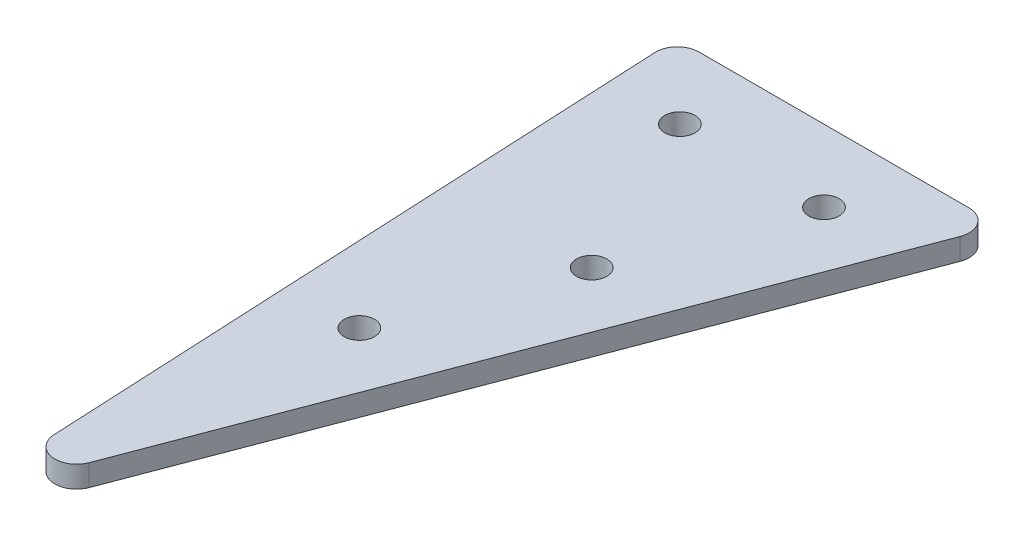
ISO-10303-21;
HEADER;
FILE_DESCRIPTION(('STEP AP214'),'2;1');
FILE_NAME('part.step','',(''),(''),'','','');
FILE_SCHEMA(('AUTOMOTIVE_DESIGN { 1 0 10303 214 1 1 1 1 }'));
ENDSEC;
DATA;
#1=APPLICATION_CONTEXT('core data for automotive mechanical design processes');
#2=APPLICATION_PROTOCOL_DEFINITION('international standard','automotive_design',2000,#1);
#3=PRODUCT_CONTEXT('',#1,'mechanical');
#4=PRODUCT('Part','Part','',(#3));
#5=PRODUCT_RELATED_PRODUCT_CATEGORY('part','',(#4));
#6=PRODUCT_DEFINITION_FORMATION('','',#4);
#7=PRODUCT_DEFINITION_CONTEXT('part definition',#1,'design');
#8=PRODUCT_DEFINITION('design','',#6,#7);
#9=PRODUCT_DEFINITION_SHAPE('','',#8);
#10=(LENGTH_UNIT() NAMED_UNIT(*) SI_UNIT(.MILLI.,.METRE.));
#11=(NAMED_UNIT(*) PLANE_ANGLE_UNIT() SI_UNIT($,.RADIAN.));
#12=(NAMED_UNIT(*) SI_UNIT($,.STERADIAN.) SOLID_ANGLE_UNIT());
#13=UNCERTAINTY_MEASURE_WITH_UNIT(LENGTH_MEASURE(1.E-05),#10,'distance_accuracy_value','');
#14=(GEOMETRIC_REPRESENTATION_CONTEXT(3) GLOBAL_UNCERTAINTY_ASSIGNED_CONTEXT((#13)) GLOBAL_UNIT_ASSIGNED_CONTEXT((#10,
#11,#12)) REPRESENTATION_CONTEXT('',''));
#15=CARTESIAN_POINT('',(0.,0.,0.));
#16=DIRECTION('',(0.,0.,1.));
#17=DIRECTION('',(1.,0.,0.));
#18=AXIS2_PLACEMENT_3D('',#15,#16,#17);
#19=CARTESIAN_POINT('',(0.,3.,0.));
#20=DIRECTION('',(0.,1.,0.));
#21=DIRECTION('',(0.,0.,1.));
#22=AXIS2_PLACEMENT_3D('',#19,#20,#21);
#23=PLANE('',#22);
#24=CARTESIAN_POINT('',(-8.86951562651772,3.,23.3737393788619));
#25=DIRECTION('',(0.,1.,0.));
#26=DIRECTION('',(0.,0.,1.));
#27=AXIS2_PLACEMENT_3D('',#24,#25,#26);
#28=CIRCLE('',#27,2.1);
#29=CARTESIAN_POINT('',(-8.86951562651772,3.,25.4737393788619));
#30=VERTEX_POINT('',#29);
#31=EDGE_CURVE('E157',#30,#30,#28,.T.);
#32=ORIENTED_EDGE('',*,*,#31,.F.);
#33=EDGE_LOOP('',(#32));
#34=FACE_BOUND('',#33,.T.);
#35=CARTESIAN_POINT('',(0.,3.,0.));
#36=DIRECTION('',(0.,1.,0.));
#37=DIRECTION('',(0.,0.,1.));
#38=AXIS2_PLACEMENT_3D('',#35,#36,#37);
#39=CIRCLE('',#38,2.1);
#40=CARTESIAN_POINT('',(0.,3.,2.1));
#41=VERTEX_POINT('',#40);
#42=EDGE_CURVE('E120',#41,#41,#39,.T.);
#43=ORIENTED_EDGE('',*,*,#42,.F.);
#44=EDGE_LOOP('',(#43));
#45=FACE_BOUND('',#44,.T.);
#46=DIRECTION('',(-1.,0.,0.));
#47=VECTOR('',#46,1.);
#48=CARTESIAN_POINT('',(-30.4953450750171,3.,-10.));
#49=LINE('',#48,#47);
#50=CARTESIAN_POINT('',(10.1432896783317,3.,-10.));
#51=VERTEX_POINT('',#50);
#52=CARTESIAN_POINT('',(-27.346741552512,3.,-10.));
#53=VERTEX_POINT('',#52);
#54=EDGE_CURVE('E128',#51,#53,#49,.T.);
#55=ORIENTED_EDGE('',*,*,#54,.T.);
#56=CARTESIAN_POINT('',(-27.346741552512,3.,-7.));
#57=DIRECTION('',(0.,1.,0.));
#58=DIRECTION('',(0.,0.,1.));
#59=AXIS2_PLACEMENT_3D('',#56,#57,#58);
#60=CIRCLE('',#59,3.);
#61=CARTESIAN_POINT('',(-30.3432388530827,3.,-6.85507268141526));
#62=VERTEX_POINT('',#61);
#63=EDGE_CURVE('E141',#53,#62,#60,.T.);
#64=ORIENTED_EDGE('',*,*,#63,.T.);
#65=DIRECTION('',(0.0483091061949142,0.,0.998832433523586));
#66=VECTOR('',#65,1.);
#67=CARTESIAN_POINT('',(-30.4953450750171,3.,-10.));
#68=LINE('',#67,#66);
#69=CARTESIAN_POINT('',(-26.1050494062996,3.,80.7731492480979));
#70=VERTEX_POINT('',#69);
#71=EDGE_CURVE('E112',#62,#70,#68,.T.);
#72=ORIENTED_EDGE('',*,*,#71,.T.);
#73=CARTESIAN_POINT('',(-23.1085521057289,3.,80.6282219295132));
#74=DIRECTION('',(0.,1.,0.));
#75=DIRECTION('',(0.,0.,1.));
#76=AXIS2_PLACEMENT_3D('',#73,#74,#75);
#77=CIRCLE('',#76,3.);
#78=CARTESIAN_POINT('',(-20.3037033802655,3.,81.6925638046953));
#79=VERTEX_POINT('',#78);
#80=EDGE_CURVE('E60',#70,#79,#77,.T.);
#81=ORIENTED_EDGE('',*,*,#80,.T.);
#82=DIRECTION('',(0.354780625060709,0.,-0.934949575154475));
#83=VECTOR('',#82,1.);
#84=CARTESIAN_POINT('',(14.4904138261881,3.,-10.));
#85=LINE('',#84,#83);
#86=CARTESIAN_POINT('',(12.9481384037951,3.,-5.93565812481787));
#87=VERTEX_POINT('',#86);
#88=EDGE_CURVE('E148',#79,#87,#85,.T.);
#89=ORIENTED_EDGE('',*,*,#88,.T.);
#90=CARTESIAN_POINT('',(10.1432896783317,3.,-7.));
#91=DIRECTION('',(0.,1.,0.));
#92=DIRECTION('',(0.,0.,1.));
#93=AXIS2_PLACEMENT_3D('',#90,#91,#92);
#94=CIRCLE('',#93,3.);
#95=EDGE_CURVE('E138',#87,#51,#94,.T.);
#96=ORIENTED_EDGE('',*,*,#95,.T.);
#97=EDGE_LOOP('',(#55,#64,#72,#81,#89,#96));
#98=FACE_BOUND('',#97,.T.);
#99=CARTESIAN_POINT('',(-20.,3.,0.));
#100=DIRECTION('',(0.,1.,0.));
#101=DIRECTION('',(0.,0.,1.));
#102=AXIS2_PLACEMENT_3D('',#99,#100,#101);
#103=CIRCLE('',#102,2.1);
#104=CARTESIAN_POINT('',(-20.,3.,2.1));
#105=VERTEX_POINT('',#104);
#106=EDGE_CURVE('E152',#105,#105,#103,.T.);
#107=ORIENTED_EDGE('',*,*,#106,.F.);
#108=EDGE_LOOP('',(#107));
#109=FACE_BOUND('',#108,.T.);
#110=CARTESIAN_POINT('',(-17.7390312530354,3.,46.7474787577237));
#111=DIRECTION('',(0.,1.,0.));
#112=DIRECTION('',(0.,0.,1.));
#113=AXIS2_PLACEMENT_3D('',#110,#111,#112);
#114=CIRCLE('',#113,2.1);
#115=CARTESIAN_POINT('',(-17.7390312530354,3.,48.8474787577237));
#116=VERTEX_POINT('',#115);
#117=EDGE_CURVE('E163',#116,#116,#114,.T.);
#118=ORIENTED_EDGE('',*,*,#117,.F.);
#119=EDGE_LOOP('',(#118));
#120=FACE_BOUND('',#119,.T.);
#121=ADVANCED_FACE('F39',(#34,#45,#98,#109,#120),#23,.T.);
#122=CARTESIAN_POINT('',(0.,0.,0.));
#123=DIRECTION('',(0.,1.,0.));
#124=DIRECTION('',(0.,0.,1.));
#125=AXIS2_PLACEMENT_3D('',#122,#123,#124);
#126=PLANE('',#125);
#127=DIRECTION('',(0.0483091061949142,0.,0.998832433523586));
#128=VECTOR('',#127,1.);
#129=CARTESIAN_POINT('',(-30.4953450750171,0.,-10.));
#130=LINE('',#129,#128);
#131=CARTESIAN_POINT('',(-30.3432388530827,0.,-6.85507268141526));
#132=VERTEX_POINT('',#131);
#133=CARTESIAN_POINT('',(-26.1050494062996,0.,80.7731492480979));
#134=VERTEX_POINT('',#133);
#135=EDGE_CURVE('E110',#132,#134,#130,.T.);
#136=ORIENTED_EDGE('',*,*,#135,.F.);
#137=CARTESIAN_POINT('',(-27.346741552512,0.,-7.));
#138=DIRECTION('',(0.,1.,0.));
#139=DIRECTION('',(0.,0.,1.));
#140=AXIS2_PLACEMENT_3D('',#137,#138,#139);
#141=CIRCLE('',#140,3.);
#142=CARTESIAN_POINT('',(-27.346741552512,0.,-10.));
#143=VERTEX_POINT('',#142);
#144=EDGE_CURVE('E93',#132,#143,#141,.F.);
#145=ORIENTED_EDGE('',*,*,#144,.T.);
#146=DIRECTION('',(-1.,0.,0.));
#147=VECTOR('',#146,1.);
#148=CARTESIAN_POINT('',(-30.4953450750171,0.,-10.));
#149=LINE('',#148,#147);
#150=CARTESIAN_POINT('',(10.1432896783317,0.,-10.));
#151=VERTEX_POINT('',#150);
#152=EDGE_CURVE('E122',#151,#143,#149,.T.);
#153=ORIENTED_EDGE('',*,*,#152,.F.);
#154=CARTESIAN_POINT('',(10.1432896783317,0.,-7.));
#155=DIRECTION('',(0.,1.,0.));
#156=DIRECTION('',(0.,0.,1.));
#157=AXIS2_PLACEMENT_3D('',#154,#155,#156);
#158=CIRCLE('',#157,3.);
#159=CARTESIAN_POINT('',(12.9481384037951,0.,-5.93565812481787));
#160=VERTEX_POINT('',#159);
#161=EDGE_CURVE('E113',#151,#160,#158,.F.);
#162=ORIENTED_EDGE('',*,*,#161,.T.);
#163=DIRECTION('',(0.354780625060709,0.,-0.934949575154475));
#164=VECTOR('',#163,1.);
#165=CARTESIAN_POINT('',(14.4904138261881,0.,-10.));
#166=LINE('',#165,#164);
#167=CARTESIAN_POINT('',(-20.3037033802655,0.,81.6925638046953));
#168=VERTEX_POINT('',#167);
#169=EDGE_CURVE('E119',#168,#160,#166,.T.);
#170=ORIENTED_EDGE('',*,*,#169,.F.);
#171=CARTESIAN_POINT('',(-23.1085521057289,0.,80.6282219295132));
#172=DIRECTION('',(0.,1.,0.));
#173=DIRECTION('',(0.,0.,1.));
#174=AXIS2_PLACEMENT_3D('',#171,#172,#173);
#175=CIRCLE('',#174,3.);
#176=EDGE_CURVE('E104',#168,#134,#175,.F.);
#177=ORIENTED_EDGE('',*,*,#176,.T.);
#178=EDGE_LOOP('',(#136,#145,#153,#162,#170,#177));
#179=FACE_BOUND('',#178,.T.);
#180=CARTESIAN_POINT('',(0.,0.,0.));
#181=DIRECTION('',(0.,1.,0.));
#182=DIRECTION('',(0.,0.,1.));
#183=AXIS2_PLACEMENT_3D('',#180,#181,#182);
#184=CIRCLE('',#183,2.1);
#185=CARTESIAN_POINT('',(0.,0.,2.1));
#186=VERTEX_POINT('',#185);
#187=EDGE_CURVE('E125',#186,#186,#184,.T.);
#188=ORIENTED_EDGE('',*,*,#187,.T.);
#189=EDGE_LOOP('',(#188));
#190=FACE_BOUND('',#189,.T.);
#191=CARTESIAN_POINT('',(-20.,0.,0.));
#192=DIRECTION('',(0.,1.,0.));
#193=DIRECTION('',(0.,0.,1.));
#194=AXIS2_PLACEMENT_3D('',#191,#192,#193);
#195=CIRCLE('',#194,2.1);
#196=CARTESIAN_POINT('',(-20.,0.,2.1));
#197=VERTEX_POINT('',#196);
#198=EDGE_CURVE('E154',#197,#197,#195,.T.);
#199=ORIENTED_EDGE('',*,*,#198,.T.);
#200=EDGE_LOOP('',(#199));
#201=FACE_BOUND('',#200,.T.);
#202=CARTESIAN_POINT('',(-8.86951562651772,0.,23.3737393788619));
#203=DIRECTION('',(0.,1.,0.));
#204=DIRECTION('',(0.,0.,1.));
#205=AXIS2_PLACEMENT_3D('',#202,#203,#204);
#206=CIRCLE('',#205,2.1);
#207=CARTESIAN_POINT('',(-8.86951562651772,0.,25.4737393788619));
#208=VERTEX_POINT('',#207);
#209=EDGE_CURVE('E160',#208,#208,#206,.T.);
#210=ORIENTED_EDGE('',*,*,#209,.T.);
#211=EDGE_LOOP('',(#210));
#212=FACE_BOUND('',#211,.T.);
#213=CARTESIAN_POINT('',(-17.7390312530354,0.,46.7474787577237));
#214=DIRECTION('',(0.,1.,0.));
#215=DIRECTION('',(0.,0.,1.));
#216=AXIS2_PLACEMENT_3D('',#213,#214,#215);
#217=CIRCLE('',#216,2.1);
#218=CARTESIAN_POINT('',(-17.7390312530354,0.,48.8474787577237));
#219=VERTEX_POINT('',#218);
#220=EDGE_CURVE('E166',#219,#219,#217,.T.);
#221=ORIENTED_EDGE('',*,*,#220,.T.);
#222=EDGE_LOOP('',(#221));
#223=FACE_BOUND('',#222,.T.);
#224=ADVANCED_FACE('F116',(#179,#190,#201,#212,#223),#126,.F.);
#225=CARTESIAN_POINT('',(-30.4953450750171,3.,-10.));
#226=DIRECTION('',(0.998832433523586,0.,-0.0483091061949142));
#227=DIRECTION('',(-0.0483091061949142,0.,-0.998832433523586));
#228=AXIS2_PLACEMENT_3D('',#225,#226,#227);
#229=PLANE('',#228);
#230=ORIENTED_EDGE('',*,*,#71,.F.);
#231=DIRECTION('',(0.,-1.,0.));
#232=VECTOR('',#231,1.);
#233=CARTESIAN_POINT('',(-30.3432388530827,3.,-6.85507268141526));
#234=LINE('',#233,#232);
#235=EDGE_CURVE('E97',#62,#132,#234,.T.);
#236=ORIENTED_EDGE('',*,*,#235,.T.);
#237=ORIENTED_EDGE('',*,*,#135,.T.);
#238=DIRECTION('',(0.,-1.,0.));
#239=VECTOR('',#238,1.);
#240=CARTESIAN_POINT('',(-26.1050494062996,3.,80.7731492480979));
#241=LINE('',#240,#239);
#242=EDGE_CURVE('E114',#134,#70,#241,.F.);
#243=ORIENTED_EDGE('',*,*,#242,.T.);
#244=EDGE_LOOP('',(#230,#236,#237,#243));
#245=FACE_BOUND('',#244,.T.);
#246=ADVANCED_FACE('F109',(#245),#229,.F.);
#247=CARTESIAN_POINT('',(14.4904138261881,3.,-10.));
#248=DIRECTION('',(-0.934949575154475,0.,-0.354780625060709));
#249=DIRECTION('',(-0.354780625060709,0.,0.934949575154475));
#250=AXIS2_PLACEMENT_3D('',#247,#248,#249);
#251=PLANE('',#250);
#252=ORIENTED_EDGE('',*,*,#88,.F.);
#253=DIRECTION('',(0.,-1.,0.));
#254=VECTOR('',#253,1.);
#255=CARTESIAN_POINT('',(-20.3037033802655,3.,81.6925638046953));
#256=LINE('',#255,#254);
#257=EDGE_CURVE('E11',#79,#168,#256,.T.);
#258=ORIENTED_EDGE('',*,*,#257,.T.);
#259=ORIENTED_EDGE('',*,*,#169,.T.);
#260=DIRECTION('',(0.,-1.,0.));
#261=VECTOR('',#260,1.);
#262=CARTESIAN_POINT('',(12.9481384037951,3.,-5.93565812481787));
#263=LINE('',#262,#261);
#264=EDGE_CURVE('E47',#160,#87,#263,.F.);
#265=ORIENTED_EDGE('',*,*,#264,.T.);
#266=EDGE_LOOP('',(#252,#258,#259,#265));
#267=FACE_BOUND('',#266,.T.);
#268=ADVANCED_FACE('F192',(#267),#251,.F.);
#269=CARTESIAN_POINT('',(-30.4953450750171,3.,-10.));
#270=DIRECTION('',(0.,0.,1.));
#271=DIRECTION('',(1.,0.,0.));
#272=AXIS2_PLACEMENT_3D('',#269,#270,#271);
#273=PLANE('',#272);
#274=ORIENTED_EDGE('',*,*,#152,.T.);
#275=DIRECTION('',(0.,-1.,0.));
#276=VECTOR('',#275,1.);
#277=CARTESIAN_POINT('',(-27.346741552512,3.,-10.));
#278=LINE('',#277,#276);
#279=EDGE_CURVE('E98',#143,#53,#278,.F.);
#280=ORIENTED_EDGE('',*,*,#279,.T.);
#281=ORIENTED_EDGE('',*,*,#54,.F.);
#282=DIRECTION('',(0.,-1.,0.));
#283=VECTOR('',#282,1.);
#284=CARTESIAN_POINT('',(10.1432896783317,3.,-10.));
#285=LINE('',#284,#283);
#286=EDGE_CURVE('E103',#51,#151,#285,.T.);
#287=ORIENTED_EDGE('',*,*,#286,.T.);
#288=EDGE_LOOP('',(#274,#280,#281,#287));
#289=FACE_BOUND('',#288,.T.);
#290=ADVANCED_FACE('F189',(#289),#273,.F.);
#291=CARTESIAN_POINT('',(0.,3.,0.));
#292=DIRECTION('',(0.,-1.,0.));
#293=DIRECTION('',(0.,0.,-1.));
#294=AXIS2_PLACEMENT_3D('',#291,#292,#293);
#295=CYLINDRICAL_SURFACE('',#294,2.1);
#296=ORIENTED_EDGE('',*,*,#42,.T.);
#297=EDGE_LOOP('',(#296));
#298=FACE_BOUND('',#297,.T.);
#299=ORIENTED_EDGE('',*,*,#187,.F.);
#300=EDGE_LOOP('',(#299));
#301=FACE_BOUND('',#300,.T.);
#302=ADVANCED_FACE('F186',(#298,#301),#295,.F.);
#303=CARTESIAN_POINT('',(-20.,3.,0.));
#304=DIRECTION('',(0.,-1.,0.));
#305=DIRECTION('',(0.,0.,-1.));
#306=AXIS2_PLACEMENT_3D('',#303,#304,#305);
#307=CYLINDRICAL_SURFACE('',#306,2.1);
#308=ORIENTED_EDGE('',*,*,#106,.T.);
#309=EDGE_LOOP('',(#308));
#310=FACE_BOUND('',#309,.T.);
#311=ORIENTED_EDGE('',*,*,#198,.F.);
#312=EDGE_LOOP('',(#311));
#313=FACE_BOUND('',#312,.T.);
#314=ADVANCED_FACE('F227',(#310,#313),#307,.F.);
#315=CARTESIAN_POINT('',(-8.86951562651772,3.,23.3737393788619));
#316=DIRECTION('',(0.,-1.,0.));
#317=DIRECTION('',(0.,0.,-1.));
#318=AXIS2_PLACEMENT_3D('',#315,#316,#317);
#319=CYLINDRICAL_SURFACE('',#318,2.1);
#320=ORIENTED_EDGE('',*,*,#31,.T.);
#321=EDGE_LOOP('',(#320));
#322=FACE_BOUND('',#321,.T.);
#323=ORIENTED_EDGE('',*,*,#209,.F.);
#324=EDGE_LOOP('',(#323));
#325=FACE_BOUND('',#324,.T.);
#326=ADVANCED_FACE('F220',(#322,#325),#319,.F.);
#327=CARTESIAN_POINT('',(-17.7390312530354,3.,46.7474787577237));
#328=DIRECTION('',(0.,-1.,0.));
#329=DIRECTION('',(0.,0.,-1.));
#330=AXIS2_PLACEMENT_3D('',#327,#328,#329);
#331=CYLINDRICAL_SURFACE('',#330,2.1);
#332=ORIENTED_EDGE('',*,*,#117,.T.);
#333=EDGE_LOOP('',(#332));
#334=FACE_BOUND('',#333,.T.);
#335=ORIENTED_EDGE('',*,*,#220,.F.);
#336=EDGE_LOOP('',(#335));
#337=FACE_BOUND('',#336,.T.);
#338=ADVANCED_FACE('F172',(#334,#337),#331,.F.);
#339=CARTESIAN_POINT('',(-27.346741552512,3.,-7.));
#340=DIRECTION('',(0.,-1.,0.));
#341=DIRECTION('',(0.,0.,-1.));
#342=AXIS2_PLACEMENT_3D('',#339,#340,#341);
#343=CYLINDRICAL_SURFACE('',#342,3.);
#344=ORIENTED_EDGE('',*,*,#63,.F.);
#345=ORIENTED_EDGE('',*,*,#279,.F.);
#346=ORIENTED_EDGE('',*,*,#144,.F.);
#347=ORIENTED_EDGE('',*,*,#235,.F.);
#348=EDGE_LOOP('',(#344,#345,#346,#347));
#349=FACE_BOUND('',#348,.T.);
#350=ADVANCED_FACE('F96',(#349),#343,.T.);
#351=CARTESIAN_POINT('',(-23.1085521057289,3.,80.6282219295132));
#352=DIRECTION('',(0.,-1.,0.));
#353=DIRECTION('',(0.,0.,-1.));
#354=AXIS2_PLACEMENT_3D('',#351,#352,#353);
#355=CYLINDRICAL_SURFACE('',#354,3.);
#356=ORIENTED_EDGE('',*,*,#80,.F.);
#357=ORIENTED_EDGE('',*,*,#242,.F.);
#358=ORIENTED_EDGE('',*,*,#176,.F.);
#359=ORIENTED_EDGE('',*,*,#257,.F.);
#360=EDGE_LOOP('',(#356,#357,#358,#359));
#361=FACE_BOUND('',#360,.T.);
#362=ADVANCED_FACE('F198',(#361),#355,.T.);
#363=CARTESIAN_POINT('',(10.1432896783317,3.,-7.));
#364=DIRECTION('',(0.,-1.,0.));
#365=DIRECTION('',(0.,0.,-1.));
#366=AXIS2_PLACEMENT_3D('',#363,#364,#365);
#367=CYLINDRICAL_SURFACE('',#366,3.);
#368=ORIENTED_EDGE('',*,*,#95,.F.);
#369=ORIENTED_EDGE('',*,*,#264,.F.);
#370=ORIENTED_EDGE('',*,*,#161,.F.);
#371=ORIENTED_EDGE('',*,*,#286,.F.);
#372=EDGE_LOOP('',(#368,#369,#370,#371));
#373=FACE_BOUND('',#372,.T.);
#374=ADVANCED_FACE('F41',(#373),#367,.T.);
#375=CLOSED_SHELL('',(#121,#224,#246,#268,#290,#302,#314,#326,#338,#350,#362,#374));
#376=MANIFOLD_SOLID_BREP('B2',#375);
#377=ADVANCED_BREP_SHAPE_REPRESENTATION('',(#18,#376),#14);
#378=SHAPE_DEFINITION_REPRESENTATION(#9,#377);
ENDSEC;
END-ISO-10303-21;
